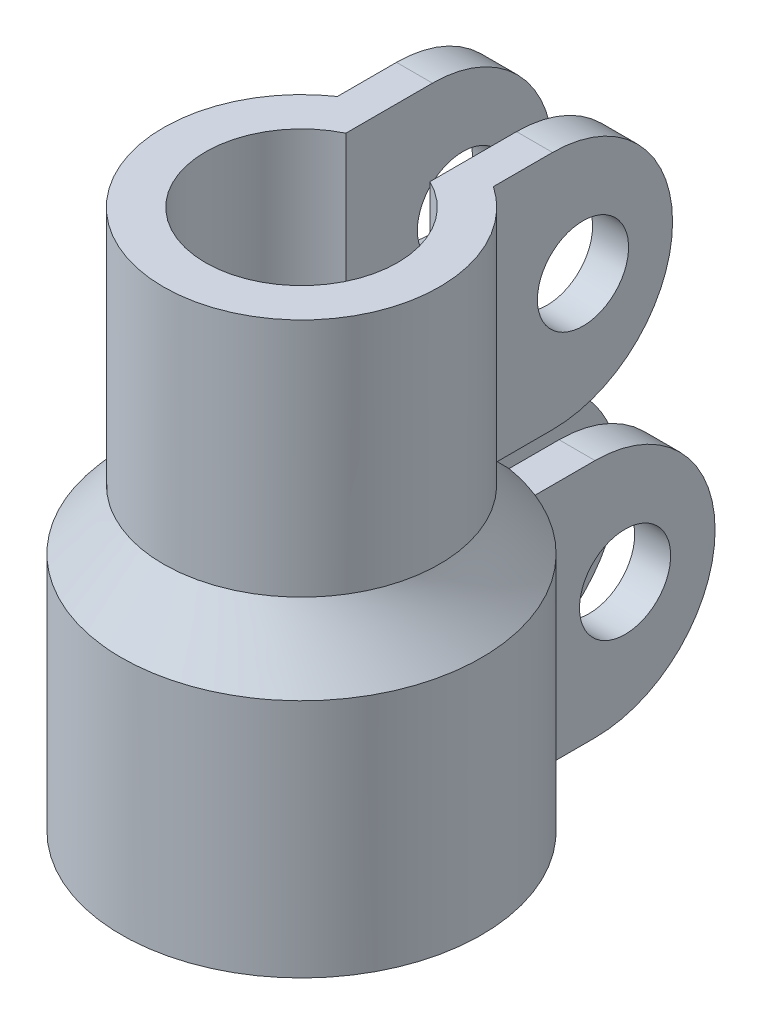
ISO-10303-21;
HEADER;
FILE_DESCRIPTION(('STEP AP214'),'2;1');
FILE_NAME('part.step','',(''),(''),'','','');
FILE_SCHEMA(('AUTOMOTIVE_DESIGN { 1 0 10303 214 1 1 1 1 }'));
ENDSEC;
DATA;
#1=APPLICATION_CONTEXT('core data for automotive mechanical design processes');
#2=APPLICATION_PROTOCOL_DEFINITION('international standard','automotive_design',2000,#1);
#3=PRODUCT_CONTEXT('',#1,'mechanical');
#4=PRODUCT('Part','Part','',(#3));
#5=PRODUCT_RELATED_PRODUCT_CATEGORY('part','',(#4));
#6=PRODUCT_DEFINITION_FORMATION('','',#4);
#7=PRODUCT_DEFINITION_CONTEXT('part definition',#1,'design');
#8=PRODUCT_DEFINITION('design','',#6,#7);
#9=PRODUCT_DEFINITION_SHAPE('','',#8);
#10=(LENGTH_UNIT() NAMED_UNIT(*) SI_UNIT(.MILLI.,.METRE.));
#11=(NAMED_UNIT(*) PLANE_ANGLE_UNIT() SI_UNIT($,.RADIAN.));
#12=(NAMED_UNIT(*) SI_UNIT($,.STERADIAN.) SOLID_ANGLE_UNIT());
#13=UNCERTAINTY_MEASURE_WITH_UNIT(LENGTH_MEASURE(1.E-05),#10,'distance_accuracy_value','');
#14=(GEOMETRIC_REPRESENTATION_CONTEXT(3) GLOBAL_UNCERTAINTY_ASSIGNED_CONTEXT((#13)) GLOBAL_UNIT_ASSIGNED_CONTEXT((#10,
#11,#12)) REPRESENTATION_CONTEXT('',''));
#15=CARTESIAN_POINT('',(0.,0.,0.));
#16=DIRECTION('',(0.,0.,1.));
#17=DIRECTION('',(1.,0.,0.));
#18=AXIS2_PLACEMENT_3D('',#15,#16,#17);
#19=CARTESIAN_POINT('',(0.,10.,0.));
#20=DIRECTION('',(0.,1.,0.));
#21=DIRECTION('',(0.,0.,1.));
#22=AXIS2_PLACEMENT_3D('',#19,#20,#21);
#23=PLANE('',#22);
#24=DIRECTION('',(0.,0.,-1.));
#25=VECTOR('',#24,1.);
#26=CARTESIAN_POINT('',(2.75,10.,-14.4776428684764));
#27=LINE('',#26,#25);
#28=CARTESIAN_POINT('',(2.75000131163433,10.,-6.97764619469728));
#29=VERTEX_POINT('',#28);
#30=CARTESIAN_POINT('',(2.75,10.,-9.47764286847643));
#31=VERTEX_POINT('',#30);
#32=EDGE_CURVE('E547',#29,#31,#27,.T.);
#33=ORIENTED_EDGE('',*,*,#32,.T.);
#34=DIRECTION('',(-1.,0.,0.));
#35=VECTOR('',#34,1.);
#36=CARTESIAN_POINT('',(1.24999999999999,10.,-9.47764286847643));
#37=LINE('',#36,#35);
#38=CARTESIAN_POINT('',(1.25,10.,-9.47764286847643));
#39=VERTEX_POINT('',#38);
#40=EDGE_CURVE('E58',#31,#39,#37,.T.);
#41=ORIENTED_EDGE('',*,*,#40,.T.);
#42=DIRECTION('',(0.,0.,1.));
#43=VECTOR('',#42,1.);
#44=CARTESIAN_POINT('',(1.25,10.,-14.4776428684764));
#45=LINE('',#44,#43);
#46=CARTESIAN_POINT('',(1.25,10.,-7.39509972887452));
#47=VERTEX_POINT('',#46);
#48=EDGE_CURVE('E542',#39,#47,#45,.T.);
#49=ORIENTED_EDGE('',*,*,#48,.T.);
#50=CARTESIAN_POINT('',(1.25,10.,-7.39509972887452));
#51=CARTESIAN_POINT('',(1.3142348254153,10.,-7.38424227098654));
#52=CARTESIAN_POINT('',(1.3783281025876,10.,-7.37254748813755));
#53=CARTESIAN_POINT('',(1.50605893350468,10.,-7.34751743854958));
#54=CARTESIAN_POINT('',(1.56969714673334,10.,-7.33418553715928));
#55=CARTESIAN_POINT('',(1.69651983990915,10.,-7.30589050781949));
#56=CARTESIAN_POINT('',(1.7597048158399,10.,-7.29092960292035));
#57=CARTESIAN_POINT('',(1.88562239175067,10.,-7.25938274945038));
#58=CARTESIAN_POINT('',(1.94835526863261,10.,-7.24279790611051));
#59=CARTESIAN_POINT('',(2.07336951501088,10.,-7.20800586957246));
#60=CARTESIAN_POINT('',(2.13565088450721,10.,-7.18979867637428));
#61=CARTESIAN_POINT('',(2.2597621359239,10.,-7.15176136365531));
#62=CARTESIAN_POINT('',(2.32159168397672,10.,-7.13193015475733));
#63=CARTESIAN_POINT('',(2.4447980403874,10.,-7.09064095605224));
#64=CARTESIAN_POINT('',(2.50617412499966,10.,-7.06918080658197));
#65=CARTESIAN_POINT('',(2.62847137646913,10.,-7.0246268973017));
#66=CARTESIAN_POINT('',(2.68939136946655,10.,-7.00152991529619));
#67=CARTESIAN_POINT('',(2.7500000006213,10.,-6.97764286823157));
#68=B_SPLINE_CURVE_WITH_KNOTS('',3,(#50,#51,#52,#53,#54,#55,#56,#57,#58,#59,#60,#61,#62,#63,#64,
#65,#66,#67),.UNSPECIFIED.,.F.,.F.,(4,2,2,2,2,2,2,2,4),(0.,0.195432346115492,0.390469472873585,
0.585243697598916,0.779886270969312,0.974528844339706,1.16930306906503,1.36434019582313,
1.55977254193858),.UNSPECIFIED.);
#69=EDGE_CURVE('E462',#47,#29,#68,.T.);
#70=ORIENTED_EDGE('',*,*,#69,.T.);
#71=EDGE_LOOP('',(#33,#41,#49,#70));
#72=FACE_BOUND('',#71,.T.);
#73=ADVANCED_FACE('F48',(#72),#23,.T.);
#74=DIRECTION('',(0.,0.,-1.));
#75=VECTOR('',#74,1.);
#76=CARTESIAN_POINT('',(-1.25,10.,-14.4776428684764));
#77=LINE('',#76,#75);
#78=CARTESIAN_POINT('',(-1.25,10.,-7.39509972887452));
#79=VERTEX_POINT('',#78);
#80=CARTESIAN_POINT('',(-1.25,10.,-9.47764286847643));
#81=VERTEX_POINT('',#80);
#82=EDGE_CURVE('E556',#79,#81,#77,.T.);
#83=ORIENTED_EDGE('',*,*,#82,.T.);
#84=DIRECTION('',(-1.,0.,0.));
#85=VECTOR('',#84,1.);
#86=CARTESIAN_POINT('',(-2.75,10.,-9.47764286847643));
#87=LINE('',#86,#85);
#88=CARTESIAN_POINT('',(-2.75,10.,-9.47764286847643));
#89=VERTEX_POINT('',#88);
#90=EDGE_CURVE('E12',#81,#89,#87,.T.);
#91=ORIENTED_EDGE('',*,*,#90,.T.);
#92=DIRECTION('',(0.,0.,1.));
#93=VECTOR('',#92,1.);
#94=CARTESIAN_POINT('',(-2.75,10.,-14.4776428684764));
#95=LINE('',#94,#93);
#96=CARTESIAN_POINT('',(-2.75000046835111,10.,-6.97764129596585));
#97=VERTEX_POINT('',#96);
#98=EDGE_CURVE('E567',#89,#97,#95,.T.);
#99=ORIENTED_EDGE('',*,*,#98,.T.);
#100=CARTESIAN_POINT('',(0.,10.,0.));
#101=DIRECTION('',(0.,1.,0.));
#102=DIRECTION('',(0.,0.,1.));
#103=AXIS2_PLACEMENT_3D('',#100,#101,#102);
#104=CIRCLE('',#103,7.5);
#105=EDGE_CURVE('E226',#79,#97,#104,.T.);
#106=ORIENTED_EDGE('',*,*,#105,.F.);
#107=EDGE_LOOP('',(#83,#91,#99,#106));
#108=FACE_BOUND('',#107,.T.);
#109=ADVANCED_FACE('F432',(#108),#23,.T.);
#110=CARTESIAN_POINT('',(0.,10.,0.));
#111=DIRECTION('',(0.,-1.,0.));
#112=DIRECTION('',(0.,0.,-1.));
#113=AXIS2_PLACEMENT_3D('',#110,#111,#112);
#114=CYLINDRICAL_SURFACE('',#113,7.5);
#115=CARTESIAN_POINT('',(0.,0.,0.));
#116=DIRECTION('',(0.,1.,0.));
#117=DIRECTION('',(0.,0.,1.));
#118=AXIS2_PLACEMENT_3D('',#115,#116,#117);
#119=CIRCLE('',#118,7.5);
#120=CARTESIAN_POINT('',(-2.75,0.,-6.97764286847643));
#121=VERTEX_POINT('',#120);
#122=CARTESIAN_POINT('',(2.75,0.,-6.97764286847643));
#123=VERTEX_POINT('',#122);
#124=EDGE_CURVE('E515',#121,#123,#119,.T.);
#125=ORIENTED_EDGE('',*,*,#124,.T.);
#126=DIRECTION('',(0.,-1.,0.));
#127=VECTOR('',#126,1.);
#128=CARTESIAN_POINT('',(2.75,10.,-6.97764286847643));
#129=LINE('',#128,#127);
#130=EDGE_CURVE('E609',#29,#123,#129,.T.);
#131=ORIENTED_EDGE('',*,*,#130,.F.);
#132=CARTESIAN_POINT('',(-1.25,10.,-7.39509972887452));
#133=CARTESIAN_POINT('',(-13.8765670294396,10.,-5.26082035936538));
#134=CARTESIAN_POINT('',(-12.8056762170548,10.,7.5));
#135=CARTESIAN_POINT('',(12.8056762170549,10.,7.5));
#136=CARTESIAN_POINT('',(13.8765670294396,10.,-5.26082035936538));
#137=CARTESIAN_POINT('',(1.25,10.,-7.39509972887452));
#138=(BOUNDED_CURVE() B_SPLINE_CURVE(3,(#132,#133,#134,#135,#136,#137),.UNSPECIFIED.,.F.,
.F.) B_SPLINE_CURVE_WITH_KNOTS((4,2,4),(0.,0.5,1.),
.UNSPECIFIED.) CURVE() GEOMETRIC_REPRESENTATION_ITEM() RATIONAL_B_SPLINE_CURVE((1.,
0.151386494083577,0.058902088932567,0.058902088932567,0.151386494083577,1.)) REPRESENTATION_ITEM(''));
#139=EDGE_CURVE('E606',#97,#29,#138,.T.);
#140=ORIENTED_EDGE('',*,*,#139,.F.);
#141=DIRECTION('',(0.,-1.,0.));
#142=VECTOR('',#141,1.);
#143=CARTESIAN_POINT('',(-2.75,10.,-6.97764286847643));
#144=LINE('',#143,#142);
#145=EDGE_CURVE('E594',#97,#121,#144,.T.);
#146=ORIENTED_EDGE('',*,*,#145,.T.);
#147=EDGE_LOOP('',(#125,#131,#140,#146));
#148=FACE_BOUND('',#147,.T.);
#149=ADVANCED_FACE('F438',(#148),#114,.T.);
#150=CARTESIAN_POINT('',(2.75,10.,-14.4776428684764));
#151=DIRECTION('',(-1.,0.,0.));
#152=DIRECTION('',(0.,0.,1.));
#153=AXIS2_PLACEMENT_3D('',#150,#151,#152);
#154=PLANE('',#153);
#155=CARTESIAN_POINT('',(2.75,5.,-10.7276420822211));
#156=DIRECTION('',(-1.,0.,0.));
#157=DIRECTION('',(0.,0.,1.));
#158=AXIS2_PLACEMENT_3D('',#155,#156,#157);
#159=CIRCLE('',#158,1.89865);
#160=CARTESIAN_POINT('',(2.75,5.,-8.82899208222114));
#161=VERTEX_POINT('',#160);
#162=EDGE_CURVE('E939',#161,#161,#159,.T.);
#163=ORIENTED_EDGE('',*,*,#162,.T.);
#164=EDGE_LOOP('',(#163));
#165=FACE_BOUND('',#164,.T.);
#166=DIRECTION('',(0.,0.,-1.));
#167=VECTOR('',#166,1.);
#168=CARTESIAN_POINT('',(2.75,0.,-14.4776428684764));
#169=LINE('',#168,#167);
#170=CARTESIAN_POINT('',(2.75,0.,-9.47764286847643));
#171=VERTEX_POINT('',#170);
#172=EDGE_CURVE('E941',#123,#171,#169,.T.);
#173=ORIENTED_EDGE('',*,*,#172,.T.);
#174=CARTESIAN_POINT('',(2.75,5.,-9.47764286847643));
#175=DIRECTION('',(-1.,0.,0.));
#176=DIRECTION('',(0.,0.,1.));
#177=AXIS2_PLACEMENT_3D('',#174,#175,#176);
#178=CIRCLE('',#177,5.);
#179=CARTESIAN_POINT('',(2.75,5.,-14.4776428684764));
#180=VERTEX_POINT('',#179);
#181=EDGE_CURVE('E591',#171,#180,#178,.F.);
#182=ORIENTED_EDGE('',*,*,#181,.T.);
#183=CARTESIAN_POINT('',(2.75,5.,-9.47764286847643));
#184=DIRECTION('',(-1.,0.,0.));
#185=DIRECTION('',(0.,0.,1.));
#186=AXIS2_PLACEMENT_3D('',#183,#184,#185);
#187=CIRCLE('',#186,5.);
#188=EDGE_CURVE('E966',#180,#31,#187,.F.);
#189=ORIENTED_EDGE('',*,*,#188,.T.);
#190=ORIENTED_EDGE('',*,*,#32,.F.);
#191=ORIENTED_EDGE('',*,*,#130,.T.);
#192=EDGE_LOOP('',(#173,#182,#189,#190,#191));
#193=FACE_BOUND('',#192,.T.);
#194=ADVANCED_FACE('F692',(#165,#193),#154,.F.);
#195=CARTESIAN_POINT('',(1.25,10.,-14.4776428684764));
#196=DIRECTION('',(1.,0.,0.));
#197=DIRECTION('',(0.,0.,-1.));
#198=AXIS2_PLACEMENT_3D('',#195,#196,#197);
#199=PLANE('',#198);
#200=CARTESIAN_POINT('',(1.25,5.,-10.7276420822211));
#201=DIRECTION('',(1.,0.,0.));
#202=DIRECTION('',(0.,0.,-1.));
#203=AXIS2_PLACEMENT_3D('',#200,#201,#202);
#204=CIRCLE('',#203,1.89865);
#205=CARTESIAN_POINT('',(1.25,5.,-12.6262920822211));
#206=VERTEX_POINT('',#205);
#207=EDGE_CURVE('E990',#206,#206,#204,.T.);
#208=ORIENTED_EDGE('',*,*,#207,.T.);
#209=EDGE_LOOP('',(#208));
#210=FACE_BOUND('',#209,.T.);
#211=CARTESIAN_POINT('',(1.25,5.,-9.47764286847643));
#212=DIRECTION('',(1.,0.,0.));
#213=DIRECTION('',(0.,0.,-1.));
#214=AXIS2_PLACEMENT_3D('',#211,#212,#213);
#215=CIRCLE('',#214,5.);
#216=CARTESIAN_POINT('',(1.25,5.,-14.4776428684764));
#217=VERTEX_POINT('',#216);
#218=EDGE_CURVE('E548',#39,#217,#215,.F.);
#219=ORIENTED_EDGE('',*,*,#218,.T.);
#220=CARTESIAN_POINT('',(1.25,5.,-9.47764286847643));
#221=DIRECTION('',(1.,0.,0.));
#222=DIRECTION('',(0.,0.,-1.));
#223=AXIS2_PLACEMENT_3D('',#220,#221,#222);
#224=CIRCLE('',#223,5.);
#225=CARTESIAN_POINT('',(1.25,0.,-9.47764286847643));
#226=VERTEX_POINT('',#225);
#227=EDGE_CURVE('E974',#217,#226,#224,.F.);
#228=ORIENTED_EDGE('',*,*,#227,.T.);
#229=DIRECTION('',(0.,0.,1.));
#230=VECTOR('',#229,1.);
#231=CARTESIAN_POINT('',(1.25,0.,-14.4776428684764));
#232=LINE('',#231,#230);
#233=CARTESIAN_POINT('',(1.25,0.,-5.86834729715275));
#234=VERTEX_POINT('',#233);
#235=EDGE_CURVE('E949',#226,#234,#232,.T.);
#236=ORIENTED_EDGE('',*,*,#235,.T.);
#237=DIRECTION('',(0.,-1.,0.));
#238=VECTOR('',#237,1.);
#239=CARTESIAN_POINT('',(1.25,10.,-5.86834729715275));
#240=LINE('',#239,#238);
#241=CARTESIAN_POINT('',(1.25000000000001,10.,-5.86834729715275));
#242=VERTEX_POINT('',#241);
#243=EDGE_CURVE('E613',#242,#234,#240,.T.);
#244=ORIENTED_EDGE('',*,*,#243,.F.);
#245=DIRECTION('',(0.,0.,1.));
#246=VECTOR('',#245,1.);
#247=CARTESIAN_POINT('',(1.25,10.,-7.39509972887452));
#248=LINE('',#247,#246);
#249=EDGE_CURVE('E571',#47,#242,#248,.T.);
#250=ORIENTED_EDGE('',*,*,#249,.F.);
#251=ORIENTED_EDGE('',*,*,#48,.F.);
#252=EDGE_LOOP('',(#219,#228,#236,#244,#250,#251));
#253=FACE_BOUND('',#252,.T.);
#254=ADVANCED_FACE('F855',(#210,#253),#199,.F.);
#255=CARTESIAN_POINT('',(0.,10.,0.));
#256=DIRECTION('',(0.,-1.,0.));
#257=DIRECTION('',(0.,0.,-1.));
#258=AXIS2_PLACEMENT_3D('',#255,#256,#257);
#259=CYLINDRICAL_SURFACE('',#258,6.);
#260=CARTESIAN_POINT('',(0.,0.,0.));
#261=DIRECTION('',(0.,-1.,0.));
#262=DIRECTION('',(0.,0.,1.));
#263=AXIS2_PLACEMENT_3D('',#260,#261,#262);
#264=CIRCLE('',#263,6.);
#265=CARTESIAN_POINT('',(-1.25,0.,-5.86834729715275));
#266=VERTEX_POINT('',#265);
#267=EDGE_CURVE('E673',#234,#266,#264,.T.);
#268=ORIENTED_EDGE('',*,*,#267,.T.);
#269=DIRECTION('',(0.,-1.,0.));
#270=VECTOR('',#269,1.);
#271=CARTESIAN_POINT('',(-1.25,10.,-5.86834729715275));
#272=LINE('',#271,#270);
#273=CARTESIAN_POINT('',(-1.25,10.,-5.86834729715275));
#274=VERTEX_POINT('',#273);
#275=EDGE_CURVE('E601',#274,#266,#272,.T.);
#276=ORIENTED_EDGE('',*,*,#275,.F.);
#277=CARTESIAN_POINT('',(0.,10.,0.));
#278=DIRECTION('',(0.,-1.,0.));
#279=DIRECTION('',(0.,0.,-1.));
#280=AXIS2_PLACEMENT_3D('',#277,#278,#279);
#281=CIRCLE('',#280,6.);
#282=EDGE_CURVE('E546',#242,#274,#281,.T.);
#283=ORIENTED_EDGE('',*,*,#282,.F.);
#284=ORIENTED_EDGE('',*,*,#243,.T.);
#285=EDGE_LOOP('',(#268,#276,#283,#284));
#286=FACE_BOUND('',#285,.T.);
#287=ADVANCED_FACE('F671',(#286),#259,.F.);
#288=CARTESIAN_POINT('',(-1.25,10.,-14.4776428684764));
#289=DIRECTION('',(-1.,0.,0.));
#290=DIRECTION('',(0.,0.,1.));
#291=AXIS2_PLACEMENT_3D('',#288,#289,#290);
#292=PLANE('',#291);
#293=CARTESIAN_POINT('',(-1.25,5.,-10.7276420822211));
#294=DIRECTION('',(-1.,0.,0.));
#295=DIRECTION('',(0.,0.,1.));
#296=AXIS2_PLACEMENT_3D('',#293,#294,#295);
#297=CIRCLE('',#296,1.89865);
#298=CARTESIAN_POINT('',(-1.25,5.,-8.82899208222114));
#299=VERTEX_POINT('',#298);
#300=EDGE_CURVE('E249',#299,#299,#297,.T.);
#301=ORIENTED_EDGE('',*,*,#300,.T.);
#302=EDGE_LOOP('',(#301));
#303=FACE_BOUND('',#302,.T.);
#304=DIRECTION('',(0.,0.,-1.));
#305=VECTOR('',#304,1.);
#306=CARTESIAN_POINT('',(-1.25,0.,-14.4776428684764));
#307=LINE('',#306,#305);
#308=CARTESIAN_POINT('',(-1.25,0.,-9.47764286847643));
#309=VERTEX_POINT('',#308);
#310=EDGE_CURVE('E955',#266,#309,#307,.T.);
#311=ORIENTED_EDGE('',*,*,#310,.T.);
#312=CARTESIAN_POINT('',(-1.25,5.,-9.47764286847643));
#313=DIRECTION('',(-1.,0.,0.));
#314=DIRECTION('',(0.,0.,1.));
#315=AXIS2_PLACEMENT_3D('',#312,#313,#314);
#316=CIRCLE('',#315,5.);
#317=CARTESIAN_POINT('',(-1.25,5.,-14.4776428684764));
#318=VERTEX_POINT('',#317);
#319=EDGE_CURVE('E339',#309,#318,#316,.F.);
#320=ORIENTED_EDGE('',*,*,#319,.T.);
#321=CARTESIAN_POINT('',(-1.25,5.,-9.47764286847643));
#322=DIRECTION('',(-1.,0.,0.));
#323=DIRECTION('',(0.,0.,1.));
#324=AXIS2_PLACEMENT_3D('',#321,#322,#323);
#325=CIRCLE('',#324,5.);
#326=EDGE_CURVE('E579',#318,#81,#325,.F.);
#327=ORIENTED_EDGE('',*,*,#326,.T.);
#328=ORIENTED_EDGE('',*,*,#82,.F.);
#329=DIRECTION('',(0.,0.,1.));
#330=VECTOR('',#329,1.);
#331=CARTESIAN_POINT('',(-1.25,10.,0.));
#332=LINE('',#331,#330);
#333=EDGE_CURVE('E464',#274,#79,#332,.F.);
#334=ORIENTED_EDGE('',*,*,#333,.F.);
#335=ORIENTED_EDGE('',*,*,#275,.T.);
#336=EDGE_LOOP('',(#311,#320,#327,#328,#334,#335));
#337=FACE_BOUND('',#336,.T.);
#338=ADVANCED_FACE('F576',(#303,#337),#292,.F.);
#339=CARTESIAN_POINT('',(-2.75,10.,-14.4776428684764));
#340=DIRECTION('',(1.,0.,0.));
#341=DIRECTION('',(0.,0.,-1.));
#342=AXIS2_PLACEMENT_3D('',#339,#340,#341);
#343=PLANE('',#342);
#344=CARTESIAN_POINT('',(-2.75,5.,-10.7276420822211));
#345=DIRECTION('',(-1.,0.,0.));
#346=DIRECTION('',(0.,0.,1.));
#347=AXIS2_PLACEMENT_3D('',#344,#345,#346);
#348=CIRCLE('',#347,1.89865);
#349=CARTESIAN_POINT('',(-2.75,5.,-8.82899208222114));
#350=VERTEX_POINT('',#349);
#351=EDGE_CURVE('E997',#350,#350,#348,.T.);
#352=ORIENTED_EDGE('',*,*,#351,.F.);
#353=EDGE_LOOP('',(#352));
#354=FACE_BOUND('',#353,.T.);
#355=CARTESIAN_POINT('',(-2.75,5.,-9.47764286847643));
#356=DIRECTION('',(1.,0.,0.));
#357=DIRECTION('',(0.,0.,-1.));
#358=AXIS2_PLACEMENT_3D('',#355,#356,#357);
#359=CIRCLE('',#358,5.);
#360=CARTESIAN_POINT('',(-2.75,5.,-14.4776428684764));
#361=VERTEX_POINT('',#360);
#362=EDGE_CURVE('E586',#89,#361,#359,.F.);
#363=ORIENTED_EDGE('',*,*,#362,.T.);
#364=CARTESIAN_POINT('',(-2.75,5.,-9.47764286847643));
#365=DIRECTION('',(1.,0.,0.));
#366=DIRECTION('',(0.,0.,-1.));
#367=AXIS2_PLACEMENT_3D('',#364,#365,#366);
#368=CIRCLE('',#367,5.);
#369=CARTESIAN_POINT('',(-2.75,0.,-9.47764286847643));
#370=VERTEX_POINT('',#369);
#371=EDGE_CURVE('E583',#361,#370,#368,.F.);
#372=ORIENTED_EDGE('',*,*,#371,.T.);
#373=DIRECTION('',(0.,0.,1.));
#374=VECTOR('',#373,1.);
#375=CARTESIAN_POINT('',(-2.75,0.,-14.4776428684764));
#376=LINE('',#375,#374);
#377=EDGE_CURVE('E560',#370,#121,#376,.T.);
#378=ORIENTED_EDGE('',*,*,#377,.T.);
#379=ORIENTED_EDGE('',*,*,#145,.F.);
#380=ORIENTED_EDGE('',*,*,#98,.F.);
#381=EDGE_LOOP('',(#363,#372,#378,#379,#380));
#382=FACE_BOUND('',#381,.T.);
#383=ADVANCED_FACE('F829',(#354,#382),#343,.F.);
#384=CARTESIAN_POINT('',(0.,0.,0.));
#385=DIRECTION('',(0.,1.,0.));
#386=DIRECTION('',(0.,0.,1.));
#387=AXIS2_PLACEMENT_3D('',#384,#385,#386);
#388=PLANE('',#387);
#389=ORIENTED_EDGE('',*,*,#235,.F.);
#390=DIRECTION('',(-1.,0.,0.));
#391=VECTOR('',#390,1.);
#392=CARTESIAN_POINT('',(0.,0.,-9.47764286847643));
#393=LINE('',#392,#391);
#394=EDGE_CURVE('E973',#226,#171,#393,.F.);
#395=ORIENTED_EDGE('',*,*,#394,.T.);
#396=ORIENTED_EDGE('',*,*,#172,.F.);
#397=ORIENTED_EDGE('',*,*,#124,.F.);
#398=ORIENTED_EDGE('',*,*,#377,.F.);
#399=DIRECTION('',(-1.,0.,0.));
#400=VECTOR('',#399,1.);
#401=CARTESIAN_POINT('',(0.,0.,-9.47764286847643));
#402=LINE('',#401,#400);
#403=EDGE_CURVE('E970',#370,#309,#402,.F.);
#404=ORIENTED_EDGE('',*,*,#403,.T.);
#405=ORIENTED_EDGE('',*,*,#310,.F.);
#406=ORIENTED_EDGE('',*,*,#267,.F.);
#407=EDGE_LOOP('',(#389,#395,#396,#397,#398,#404,#405,#406));
#408=FACE_BOUND('',#407,.T.);
#409=ADVANCED_FACE('F446',(#408),#388,.F.);
#410=CARTESIAN_POINT('',(3.85906040268456,2.70134228187919,0.));
#411=DIRECTION('',(-0.819231920519041,-0.573462344363328,0.));
#412=DIRECTION('',(0.573462344363328,-0.819231920519041,0.));
#413=AXIS2_PLACEMENT_3D('',#410,#411,#412);
#414=PLANE('',#413);
#415=DIRECTION('',(-0.444338036937529,0.634768624196471,0.63216493311969));
#416=VECTOR('',#415,1.);
#417=CARTESIAN_POINT('',(-1.25,10.,-7.39509972887452));
#418=LINE('',#417,#416);
#419=CARTESIAN_POINT('',(-3.,12.5,-4.90535421758715));
#420=VERTEX_POINT('',#419);
#421=EDGE_CURVE('E655',#79,#420,#418,.T.);
#422=ORIENTED_EDGE('',*,*,#421,.T.);
#423=DIRECTION('',(0.,0.,-1.));
#424=VECTOR('',#423,1.);
#425=CARTESIAN_POINT('',(-3.,12.5,-4.90535421758715));
#426=LINE('',#425,#424);
#427=CARTESIAN_POINT('',(-3.,12.5,-3.01039864469807));
#428=VERTEX_POINT('',#427);
#429=EDGE_CURVE('E271',#428,#420,#426,.T.);
#430=ORIENTED_EDGE('',*,*,#429,.F.);
#431=DIRECTION('',(-0.418564828226014,0.597949754608591,0.683563878167691));
#432=VECTOR('',#431,1.);
#433=CARTESIAN_POINT('',(-1.25,10.,-5.86834729715275));
#434=LINE('',#433,#432);
#435=EDGE_CURVE('E641',#274,#428,#434,.T.);
#436=ORIENTED_EDGE('',*,*,#435,.F.);
#437=ORIENTED_EDGE('',*,*,#333,.T.);
#438=EDGE_LOOP('',(#422,#430,#436,#437));
#439=FACE_BOUND('',#438,.T.);
#440=ADVANCED_FACE('F669',(#439),#414,.F.);
#441=CARTESIAN_POINT('',(1.25000000000001,10.,-5.86834729715275));
#442=CARTESIAN_POINT('',(3.,12.5,-3.01039864469807));
#443=CARTESIAN_POINT('',(10.9004949255246,10.,-3.8127227667575));
#444=CARTESIAN_POINT('',(6.15488313024357,12.5,0.133586756504486));
#445=CARTESIAN_POINT('',(9.86699774589713,10.,6.00000000000001));
#446=CARTESIAN_POINT('',(4.45397931837029,12.5,4.25));
#447=CARTESIAN_POINT('',(-9.86699774589714,10.,5.99999999999999));
#448=CARTESIAN_POINT('',(-4.45397931837029,12.5,4.25));
#449=CARTESIAN_POINT('',(-10.9004949255246,10.,-3.81272276675752));
#450=CARTESIAN_POINT('',(-6.15488313024357,12.5,0.133586756504488));
#451=CARTESIAN_POINT('',(-1.25,10.,-5.86834729715275));
#452=CARTESIAN_POINT('',(-3.,12.5,-3.01039864469807));
#453=(BOUNDED_SURFACE() B_SPLINE_SURFACE(3,1,((#441,#442),(#443,#444),(#445,#446),(#447,#448),
(#449,#450),(#451,#452)),.UNSPECIFIED.,.F.,.F.,.F.) B_SPLINE_SURFACE_WITH_KNOTS((4,2,4),(2,2),
(0.,0.5,1.),(0.,1.),
.UNSPECIFIED.) GEOMETRIC_REPRESENTATION_ITEM() RATIONAL_B_SPLINE_SURFACE(((1.,1.),
(0.162539502072891,0.345653127778946),(0.0655297313484511,0.20321732796769),(0.0655297313484511,
0.20321732796769),(0.162539502072891,0.345653127778946),(1.,1.))) REPRESENTATION_ITEM('') SURFACE());
#454=CARTESIAN_POINT('',(0.,12.5,0.));
#455=DIRECTION('',(0.,-1.,0.));
#456=DIRECTION('',(0.,0.,1.));
#457=AXIS2_PLACEMENT_3D('',#454,#455,#456);
#458=CIRCLE('',#457,4.25);
#459=CARTESIAN_POINT('',(3.,12.5,-3.01039864469807));
#460=VERTEX_POINT('',#459);
#461=EDGE_CURVE('E516',#460,#428,#458,.T.);
#462=DIRECTION('',(0.418564828226012,0.597949754608591,0.683563878167691));
#463=VECTOR('',#462,1.);
#464=CARTESIAN_POINT('',(1.25000000000001,10.,-5.86834729715275));
#465=LINE('',#464,#463);
#466=EDGE_CURVE('E638',#242,#460,#465,.T.);
#467=ORIENTED_EDGE('',*,*,#282,.T.);
#468=ORIENTED_EDGE('',*,*,#435,.T.);
#469=ORIENTED_EDGE('',*,*,#461,.F.);
#470=ORIENTED_EDGE('',*,*,#466,.F.);
#471=EDGE_LOOP('',(#467,#468,#469,#470));
#472=FACE_BOUND('',#471,.T.);
#473=ADVANCED_FACE('F472',(#472),#453,.T.);
#474=CARTESIAN_POINT('',(-1.25,10.,-7.39509972887452));
#475=CARTESIAN_POINT('',(-3.,12.5,-4.90535421758715));
#476=CARTESIAN_POINT('',(-13.8765670294396,10.,-5.26082035936538));
#477=CARTESIAN_POINT('',(-9.12412868937518,12.5,-1.15998023373597));
#478=CARTESIAN_POINT('',(-12.8056762170548,10.,7.5));
#479=CARTESIAN_POINT('',(-7.17863346904809,12.5,5.75));
#480=CARTESIAN_POINT('',(12.8056762170549,10.,7.5));
#481=CARTESIAN_POINT('',(7.17863346904809,12.5,5.75));
#482=CARTESIAN_POINT('',(13.8765670294396,10.,-5.26082035936538));
#483=CARTESIAN_POINT('',(9.12412868937518,12.5,-1.15998023373597));
#484=CARTESIAN_POINT('',(1.25,10.,-7.39509972887452));
#485=CARTESIAN_POINT('',(3.,12.5,-4.90535421758715));
#486=(BOUNDED_SURFACE() B_SPLINE_SURFACE(3,1,((#474,#475),(#476,#477),(#478,#479),(#480,#481),
(#482,#483),(#484,#485)),.UNSPECIFIED.,.F.,.F.,.F.) B_SPLINE_SURFACE_WITH_KNOTS((4,2,4),(2,2),
(0.,0.5,1.),(0.,1.),
.UNSPECIFIED.) GEOMETRIC_REPRESENTATION_ITEM() RATIONAL_B_SPLINE_SURFACE(((1.,1.),
(0.151386494083577,0.264204167413399),(0.058902088932567,0.135803041124397),(0.058902088932567,
0.135803041124397),(0.151386494083577,0.264204167413399),(1.,1.))) REPRESENTATION_ITEM('') SURFACE());
#487=DIRECTION('',(0.44433803693753,0.634768624196471,0.63216493311969));
#488=VECTOR('',#487,1.);
#489=CARTESIAN_POINT('',(2.125,11.25,-6.15022697323083));
#490=LINE('',#489,#488);
#491=CARTESIAN_POINT('',(3.,12.5,-4.90535421758715));
#492=VERTEX_POINT('',#491);
#493=EDGE_CURVE('E648',#47,#492,#490,.T.);
#494=CARTESIAN_POINT('',(0.,12.5,0.));
#495=DIRECTION('',(0.,1.,0.));
#496=DIRECTION('',(0.,0.,1.));
#497=AXIS2_PLACEMENT_3D('',#494,#495,#496);
#498=CIRCLE('',#497,5.75);
#499=CARTESIAN_POINT('',(3.25000039663741,12.5,-4.74341536788376));
#500=VERTEX_POINT('',#499);
#501=EDGE_CURVE('E511',#500,#492,#498,.T.);
#502=CARTESIAN_POINT('',(2.99999999999938,12.4999999999991,-4.90535421758802));
#503=CARTESIAN_POINT('',(9.12412868937613,12.4999999999995,-1.1599802337368));
#504=CARTESIAN_POINT('',(7.17863346904894,12.4999999999996,5.75000000000027));
#505=CARTESIAN_POINT('',(-7.17863346904894,12.4999999999996,5.75000000000027));
#506=CARTESIAN_POINT('',(-9.12412868937613,12.4999999999995,-1.1599802337368));
#507=CARTESIAN_POINT('',(-2.99999999999939,12.4999999999991,-4.90535421758802));
#508=(BOUNDED_CURVE() B_SPLINE_CURVE(3,(#502,#503,#504,#505,#506,#507),.UNSPECIFIED.,.F.,
.F.) B_SPLINE_CURVE_WITH_KNOTS((4,2,4),(0.,0.5,1.),
.UNSPECIFIED.) CURVE() GEOMETRIC_REPRESENTATION_ITEM() RATIONAL_B_SPLINE_CURVE((1.,
0.264204167413359,0.13580304112437,0.13580304112437,0.264204167413359,1.)) REPRESENTATION_ITEM(''));
#509=CARTESIAN_POINT('',(-3.25000139553293,12.5,-4.74341254106969));
#510=VERTEX_POINT('',#509);
#511=EDGE_CURVE('E320',#510,#500,#508,.F.);
#512=EDGE_CURVE('E324',#420,#510,#498,.T.);
#513=ORIENTED_EDGE('',*,*,#105,.T.);
#514=ORIENTED_EDGE('',*,*,#139,.T.);
#515=ORIENTED_EDGE('',*,*,#69,.F.);
#516=ORIENTED_EDGE('',*,*,#493,.T.);
#517=ORIENTED_EDGE('',*,*,#501,.F.);
#518=ORIENTED_EDGE('',*,*,#511,.F.);
#519=ORIENTED_EDGE('',*,*,#512,.F.);
#520=ORIENTED_EDGE('',*,*,#421,.F.);
#521=EDGE_LOOP('',(#513,#514,#515,#516,#517,#518,#519,#520));
#522=FACE_BOUND('',#521,.T.);
#523=ADVANCED_FACE('F466',(#522),#486,.T.);
#524=CARTESIAN_POINT('',(-3.85906040268455,2.70134228187917,0.));
#525=DIRECTION('',(0.819231920519042,-0.573462344363327,0.));
#526=DIRECTION('',(0.573462344363327,0.819231920519042,0.));
#527=AXIS2_PLACEMENT_3D('',#524,#525,#526);
#528=PLANE('',#527);
#529=ORIENTED_EDGE('',*,*,#466,.T.);
#530=DIRECTION('',(0.,0.,1.));
#531=VECTOR('',#530,1.);
#532=CARTESIAN_POINT('',(3.,12.5,-4.90535421758715));
#533=LINE('',#532,#531);
#534=EDGE_CURVE('E534',#492,#460,#533,.T.);
#535=ORIENTED_EDGE('',*,*,#534,.F.);
#536=ORIENTED_EDGE('',*,*,#493,.F.);
#537=ORIENTED_EDGE('',*,*,#249,.T.);
#538=EDGE_LOOP('',(#529,#535,#536,#537));
#539=FACE_BOUND('',#538,.T.);
#540=ADVANCED_FACE('F288',(#539),#528,.F.);
#541=CARTESIAN_POINT('',(0.,12.5,0.));
#542=DIRECTION('',(0.,1.,0.));
#543=DIRECTION('',(0.,0.,1.));
#544=AXIS2_PLACEMENT_3D('',#541,#542,#543);
#545=PLANE('',#544);
#546=DIRECTION('',(0.,0.,1.));
#547=VECTOR('',#546,1.);
#548=CARTESIAN_POINT('',(-3.25,12.5,-12.2061692138082));
#549=LINE('',#548,#547);
#550=CARTESIAN_POINT('',(-3.25,12.5,-7.20616921380822));
#551=VERTEX_POINT('',#550);
#552=EDGE_CURVE('E221',#551,#510,#549,.T.);
#553=ORIENTED_EDGE('',*,*,#552,.F.);
#554=DIRECTION('',(-1.,0.,0.));
#555=VECTOR('',#554,1.);
#556=CARTESIAN_POINT('',(0.,12.5,-7.20616921380822));
#557=LINE('',#556,#555);
#558=CARTESIAN_POINT('',(-1.75,12.5,-7.20616921380822));
#559=VERTEX_POINT('',#558);
#560=EDGE_CURVE('E351',#551,#559,#557,.F.);
#561=ORIENTED_EDGE('',*,*,#560,.T.);
#562=DIRECTION('',(0.,0.,-1.));
#563=VECTOR('',#562,1.);
#564=CARTESIAN_POINT('',(-1.75,12.5,-5.12362607420631));
#565=LINE('',#564,#563);
#566=CARTESIAN_POINT('',(-1.75,12.5,-3.59687364248454));
#567=VERTEX_POINT('',#566);
#568=EDGE_CURVE('E245',#567,#559,#565,.T.);
#569=ORIENTED_EDGE('',*,*,#568,.F.);
#570=CARTESIAN_POINT('',(0.,12.5,0.));
#571=DIRECTION('',(0.,-1.,0.));
#572=DIRECTION('',(0.,0.,1.));
#573=AXIS2_PLACEMENT_3D('',#570,#571,#572);
#574=CIRCLE('',#573,4.);
#575=CARTESIAN_POINT('',(1.75,12.5,-3.59687364248454));
#576=VERTEX_POINT('',#575);
#577=EDGE_CURVE('E253',#576,#567,#574,.T.);
#578=ORIENTED_EDGE('',*,*,#577,.F.);
#579=DIRECTION('',(0.,0.,1.));
#580=VECTOR('',#579,1.);
#581=CARTESIAN_POINT('',(1.75,12.5,-5.12362607420631));
#582=LINE('',#581,#580);
#583=CARTESIAN_POINT('',(1.75,12.5,-7.20616921380822));
#584=VERTEX_POINT('',#583);
#585=EDGE_CURVE('E250',#584,#576,#582,.T.);
#586=ORIENTED_EDGE('',*,*,#585,.F.);
#587=DIRECTION('',(-1.,0.,0.));
#588=VECTOR('',#587,1.);
#589=CARTESIAN_POINT('',(0.,12.5,-7.20616921380822));
#590=LINE('',#589,#588);
#591=CARTESIAN_POINT('',(3.25,12.5,-7.20616921380822));
#592=VERTEX_POINT('',#591);
#593=EDGE_CURVE('E347',#584,#592,#590,.F.);
#594=ORIENTED_EDGE('',*,*,#593,.T.);
#595=DIRECTION('',(0.,0.,-1.));
#596=VECTOR('',#595,1.);
#597=CARTESIAN_POINT('',(3.25,12.5,-12.2061692138082));
#598=LINE('',#597,#596);
#599=EDGE_CURVE('E254',#500,#592,#598,.T.);
#600=ORIENTED_EDGE('',*,*,#599,.F.);
#601=ORIENTED_EDGE('',*,*,#501,.T.);
#602=ORIENTED_EDGE('',*,*,#534,.T.);
#603=ORIENTED_EDGE('',*,*,#461,.T.);
#604=ORIENTED_EDGE('',*,*,#429,.T.);
#605=ORIENTED_EDGE('',*,*,#512,.T.);
#606=EDGE_LOOP('',(#553,#561,#569,#578,#586,#594,#600,#601,#602,#603,#604,#605));
#607=FACE_BOUND('',#606,.T.);
#608=ADVANCED_FACE('F277',(#607),#545,.F.);
#609=CARTESIAN_POINT('',(-1.75,22.5,-5.12362607420631));
#610=DIRECTION('',(-1.,0.,0.));
#611=DIRECTION('',(0.,0.,1.));
#612=AXIS2_PLACEMENT_3D('',#609,#610,#611);
#613=PLANE('',#612);
#614=CARTESIAN_POINT('',(-1.75,17.5,-8.4747928520304));
#615=DIRECTION('',(-1.,0.,0.));
#616=DIRECTION('',(0.,0.,1.));
#617=AXIS2_PLACEMENT_3D('',#614,#615,#616);
#618=CIRCLE('',#617,1.89864999999999);
#619=CARTESIAN_POINT('',(-1.75,17.5,-6.5761428520304));
#620=VERTEX_POINT('',#619);
#621=EDGE_CURVE('E541',#620,#620,#618,.T.);
#622=ORIENTED_EDGE('',*,*,#621,.T.);
#623=EDGE_LOOP('',(#622));
#624=FACE_BOUND('',#623,.T.);
#625=ORIENTED_EDGE('',*,*,#568,.T.);
#626=CARTESIAN_POINT('',(-1.75,17.5,-7.20616921380822));
#627=DIRECTION('',(-1.,0.,0.));
#628=DIRECTION('',(0.,0.,1.));
#629=AXIS2_PLACEMENT_3D('',#626,#627,#628);
#630=CIRCLE('',#629,5.);
#631=CARTESIAN_POINT('',(-1.75,17.5,-12.2061692138082));
#632=VERTEX_POINT('',#631);
#633=EDGE_CURVE('E358',#559,#632,#630,.F.);
#634=ORIENTED_EDGE('',*,*,#633,.T.);
#635=CARTESIAN_POINT('',(-1.75,17.5,-7.20616921380822));
#636=DIRECTION('',(-1.,0.,0.));
#637=DIRECTION('',(0.,0.,1.));
#638=AXIS2_PLACEMENT_3D('',#635,#636,#637);
#639=CIRCLE('',#638,5.);
#640=CARTESIAN_POINT('',(-1.75,22.5,-7.20616921380822));
#641=VERTEX_POINT('',#640);
#642=EDGE_CURVE('E355',#632,#641,#639,.F.);
#643=ORIENTED_EDGE('',*,*,#642,.T.);
#644=DIRECTION('',(0.,0.,-1.));
#645=VECTOR('',#644,1.);
#646=CARTESIAN_POINT('',(-1.75,22.5,-5.12362607420631));
#647=LINE('',#646,#645);
#648=CARTESIAN_POINT('',(-1.75,22.5,-3.59687364248454));
#649=VERTEX_POINT('',#648);
#650=EDGE_CURVE('E215',#649,#641,#647,.T.);
#651=ORIENTED_EDGE('',*,*,#650,.F.);
#652=DIRECTION('',(0.,-1.,0.));
#653=VECTOR('',#652,1.);
#654=CARTESIAN_POINT('',(-1.75,22.5,-3.59687364248454));
#655=LINE('',#654,#653);
#656=EDGE_CURVE('E244',#649,#567,#655,.T.);
#657=ORIENTED_EDGE('',*,*,#656,.T.);
#658=EDGE_LOOP('',(#625,#634,#643,#651,#657));
#659=FACE_BOUND('',#658,.T.);
#660=ADVANCED_FACE('F287',(#624,#659),#613,.F.);
#661=CARTESIAN_POINT('',(-3.25,22.5,-12.2061692138082));
#662=DIRECTION('',(1.,0.,0.));
#663=DIRECTION('',(0.,0.,-1.));
#664=AXIS2_PLACEMENT_3D('',#661,#662,#663);
#665=PLANE('',#664);
#666=CARTESIAN_POINT('',(-3.25,17.5,-8.4747928520304));
#667=DIRECTION('',(-1.,0.,0.));
#668=DIRECTION('',(0.,0.,1.));
#669=AXIS2_PLACEMENT_3D('',#666,#667,#668);
#670=CIRCLE('',#669,1.89864999999999);
#671=CARTESIAN_POINT('',(-3.25,17.5,-6.57614285203041));
#672=VERTEX_POINT('',#671);
#673=EDGE_CURVE('E382',#672,#672,#670,.T.);
#674=ORIENTED_EDGE('',*,*,#673,.F.);
#675=EDGE_LOOP('',(#674));
#676=FACE_BOUND('',#675,.T.);
#677=CARTESIAN_POINT('',(-3.25,17.5,-7.20616921380822));
#678=DIRECTION('',(1.,0.,0.));
#679=DIRECTION('',(0.,0.,-1.));
#680=AXIS2_PLACEMENT_3D('',#677,#678,#679);
#681=CIRCLE('',#680,5.);
#682=CARTESIAN_POINT('',(-3.25,22.5,-7.20616921380822));
#683=VERTEX_POINT('',#682);
#684=CARTESIAN_POINT('',(-3.25,17.5,-12.2061692138082));
#685=VERTEX_POINT('',#684);
#686=EDGE_CURVE('E341',#683,#685,#681,.F.);
#687=ORIENTED_EDGE('',*,*,#686,.T.);
#688=CARTESIAN_POINT('',(-3.25,17.5,-7.20616921380822));
#689=DIRECTION('',(1.,0.,0.));
#690=DIRECTION('',(0.,0.,-1.));
#691=AXIS2_PLACEMENT_3D('',#688,#689,#690);
#692=CIRCLE('',#691,5.);
#693=EDGE_CURVE('E344',#685,#551,#692,.F.);
#694=ORIENTED_EDGE('',*,*,#693,.T.);
#695=ORIENTED_EDGE('',*,*,#552,.T.);
#696=DIRECTION('',(0.,-1.,0.));
#697=VECTOR('',#696,1.);
#698=CARTESIAN_POINT('',(-3.25,22.5,-4.74341649025257));
#699=LINE('',#698,#697);
#700=CARTESIAN_POINT('',(-3.25,22.5,-4.74341649025257));
#701=VERTEX_POINT('',#700);
#702=EDGE_CURVE('E218',#701,#510,#699,.T.);
#703=ORIENTED_EDGE('',*,*,#702,.F.);
#704=DIRECTION('',(0.,0.,1.));
#705=VECTOR('',#704,1.);
#706=CARTESIAN_POINT('',(-3.25,22.5,-12.2061692138082));
#707=LINE('',#706,#705);
#708=EDGE_CURVE('E203',#683,#701,#707,.T.);
#709=ORIENTED_EDGE('',*,*,#708,.F.);
#710=EDGE_LOOP('',(#687,#694,#695,#703,#709));
#711=FACE_BOUND('',#710,.T.);
#712=ADVANCED_FACE('F219',(#676,#711),#665,.F.);
#713=CARTESIAN_POINT('',(0.,22.5,0.));
#714=DIRECTION('',(0.,-1.,0.));
#715=DIRECTION('',(0.,0.,-1.));
#716=AXIS2_PLACEMENT_3D('',#713,#714,#715);
#717=CYLINDRICAL_SURFACE('',#716,5.75);
#718=ORIENTED_EDGE('',*,*,#511,.T.);
#719=DIRECTION('',(0.,-1.,0.));
#720=VECTOR('',#719,1.);
#721=CARTESIAN_POINT('',(3.25,22.5,-4.74341649025257));
#722=LINE('',#721,#720);
#723=CARTESIAN_POINT('',(3.25,22.5,-4.74341649025257));
#724=VERTEX_POINT('',#723);
#725=EDGE_CURVE('E227',#724,#500,#722,.T.);
#726=ORIENTED_EDGE('',*,*,#725,.F.);
#727=CARTESIAN_POINT('',(0.,22.5,0.));
#728=DIRECTION('',(0.,1.,0.));
#729=DIRECTION('',(0.,0.,1.));
#730=AXIS2_PLACEMENT_3D('',#727,#728,#729);
#731=CIRCLE('',#730,5.75);
#732=EDGE_CURVE('E208',#701,#724,#731,.T.);
#733=ORIENTED_EDGE('',*,*,#732,.F.);
#734=ORIENTED_EDGE('',*,*,#702,.T.);
#735=EDGE_LOOP('',(#718,#726,#733,#734));
#736=FACE_BOUND('',#735,.T.);
#737=ADVANCED_FACE('F229',(#736),#717,.T.);
#738=CARTESIAN_POINT('',(3.25,22.5,-12.2061692138082));
#739=DIRECTION('',(-1.,0.,0.));
#740=DIRECTION('',(0.,0.,1.));
#741=AXIS2_PLACEMENT_3D('',#738,#739,#740);
#742=PLANE('',#741);
#743=CARTESIAN_POINT('',(3.25,17.5,-8.4747928520304));
#744=DIRECTION('',(-1.,0.,0.));
#745=DIRECTION('',(0.,0.,1.));
#746=AXIS2_PLACEMENT_3D('',#743,#744,#745);
#747=CIRCLE('',#746,1.89864999999999);
#748=CARTESIAN_POINT('',(3.25,17.5,-6.5761428520304));
#749=VERTEX_POINT('',#748);
#750=EDGE_CURVE('E1003',#749,#749,#747,.T.);
#751=ORIENTED_EDGE('',*,*,#750,.T.);
#752=EDGE_LOOP('',(#751));
#753=FACE_BOUND('',#752,.T.);
#754=ORIENTED_EDGE('',*,*,#599,.T.);
#755=CARTESIAN_POINT('',(3.25,17.5,-7.20616921380822));
#756=DIRECTION('',(-1.,0.,0.));
#757=DIRECTION('',(0.,0.,1.));
#758=AXIS2_PLACEMENT_3D('',#755,#756,#757);
#759=CIRCLE('',#758,5.);
#760=CARTESIAN_POINT('',(3.25,17.5,-12.2061692138082));
#761=VERTEX_POINT('',#760);
#762=EDGE_CURVE('E71',#592,#761,#759,.F.);
#763=ORIENTED_EDGE('',*,*,#762,.T.);
#764=CARTESIAN_POINT('',(3.25,17.5,-7.20616921380822));
#765=DIRECTION('',(-1.,0.,0.));
#766=DIRECTION('',(0.,0.,1.));
#767=AXIS2_PLACEMENT_3D('',#764,#765,#766);
#768=CIRCLE('',#767,5.);
#769=CARTESIAN_POINT('',(3.25,22.5,-7.20616921380822));
#770=VERTEX_POINT('',#769);
#771=EDGE_CURVE('E66',#761,#770,#768,.F.);
#772=ORIENTED_EDGE('',*,*,#771,.T.);
#773=DIRECTION('',(0.,0.,-1.));
#774=VECTOR('',#773,1.);
#775=CARTESIAN_POINT('',(3.25,22.5,-12.2061692138082));
#776=LINE('',#775,#774);
#777=EDGE_CURVE('E232',#724,#770,#776,.T.);
#778=ORIENTED_EDGE('',*,*,#777,.F.);
#779=ORIENTED_EDGE('',*,*,#725,.T.);
#780=EDGE_LOOP('',(#754,#763,#772,#778,#779));
#781=FACE_BOUND('',#780,.T.);
#782=ADVANCED_FACE('F420',(#753,#781),#742,.F.);
#783=CARTESIAN_POINT('',(1.75,22.5,-5.12362607420631));
#784=DIRECTION('',(1.,0.,0.));
#785=DIRECTION('',(0.,0.,-1.));
#786=AXIS2_PLACEMENT_3D('',#783,#784,#785);
#787=PLANE('',#786);
#788=CARTESIAN_POINT('',(1.75,17.5,-8.4747928520304));
#789=DIRECTION('',(1.,0.,0.));
#790=DIRECTION('',(0.,0.,-1.));
#791=AXIS2_PLACEMENT_3D('',#788,#789,#790);
#792=CIRCLE('',#791,1.89864999999999);
#793=CARTESIAN_POINT('',(1.75,17.5,-10.3734428520304));
#794=VERTEX_POINT('',#793);
#795=EDGE_CURVE('E537',#794,#794,#792,.T.);
#796=ORIENTED_EDGE('',*,*,#795,.T.);
#797=EDGE_LOOP('',(#796));
#798=FACE_BOUND('',#797,.T.);
#799=CARTESIAN_POINT('',(1.75,17.5,-7.20616921380822));
#800=DIRECTION('',(1.,0.,0.));
#801=DIRECTION('',(0.,0.,-1.));
#802=AXIS2_PLACEMENT_3D('',#799,#800,#801);
#803=CIRCLE('',#802,5.);
#804=CARTESIAN_POINT('',(1.75,22.5,-7.20616921380822));
#805=VERTEX_POINT('',#804);
#806=CARTESIAN_POINT('',(1.75,17.5,-12.2061692138082));
#807=VERTEX_POINT('',#806);
#808=EDGE_CURVE('E361',#805,#807,#803,.F.);
#809=ORIENTED_EDGE('',*,*,#808,.T.);
#810=CARTESIAN_POINT('',(1.75,17.5,-7.20616921380822));
#811=DIRECTION('',(1.,0.,0.));
#812=DIRECTION('',(0.,0.,-1.));
#813=AXIS2_PLACEMENT_3D('',#810,#811,#812);
#814=CIRCLE('',#813,5.);
#815=EDGE_CURVE('E364',#807,#584,#814,.F.);
#816=ORIENTED_EDGE('',*,*,#815,.T.);
#817=ORIENTED_EDGE('',*,*,#585,.T.);
#818=DIRECTION('',(0.,-1.,0.));
#819=VECTOR('',#818,1.);
#820=CARTESIAN_POINT('',(1.75,22.5,-3.59687364248454));
#821=LINE('',#820,#819);
#822=CARTESIAN_POINT('',(1.75,22.5,-3.59687364248454));
#823=VERTEX_POINT('',#822);
#824=EDGE_CURVE('E261',#823,#576,#821,.T.);
#825=ORIENTED_EDGE('',*,*,#824,.F.);
#826=DIRECTION('',(0.,0.,1.));
#827=VECTOR('',#826,1.);
#828=CARTESIAN_POINT('',(1.75,22.5,-5.12362607420631));
#829=LINE('',#828,#827);
#830=EDGE_CURVE('E235',#805,#823,#829,.T.);
#831=ORIENTED_EDGE('',*,*,#830,.F.);
#832=EDGE_LOOP('',(#809,#816,#817,#825,#831));
#833=FACE_BOUND('',#832,.T.);
#834=ADVANCED_FACE('F405',(#798,#833),#787,.F.);
#835=CARTESIAN_POINT('',(0.,22.5,0.));
#836=DIRECTION('',(0.,-1.,0.));
#837=DIRECTION('',(0.,0.,-1.));
#838=AXIS2_PLACEMENT_3D('',#835,#836,#837);
#839=CYLINDRICAL_SURFACE('',#838,4.);
#840=ORIENTED_EDGE('',*,*,#577,.T.);
#841=ORIENTED_EDGE('',*,*,#656,.F.);
#842=CARTESIAN_POINT('',(0.,22.5,0.));
#843=DIRECTION('',(0.,-1.,0.));
#844=DIRECTION('',(0.,0.,1.));
#845=AXIS2_PLACEMENT_3D('',#842,#843,#844);
#846=CIRCLE('',#845,4.);
#847=EDGE_CURVE('E241',#823,#649,#846,.T.);
#848=ORIENTED_EDGE('',*,*,#847,.F.);
#849=ORIENTED_EDGE('',*,*,#824,.T.);
#850=EDGE_LOOP('',(#840,#841,#848,#849));
#851=FACE_BOUND('',#850,.T.);
#852=ADVANCED_FACE('F290',(#851),#839,.F.);
#853=CARTESIAN_POINT('',(0.,22.5,0.));
#854=DIRECTION('',(0.,1.,0.));
#855=DIRECTION('',(0.,0.,1.));
#856=AXIS2_PLACEMENT_3D('',#853,#854,#855);
#857=PLANE('',#856);
#858=ORIENTED_EDGE('',*,*,#650,.T.);
#859=DIRECTION('',(-1.,0.,0.));
#860=VECTOR('',#859,1.);
#861=CARTESIAN_POINT('',(-3.25,22.5,-7.20616921380822));
#862=LINE('',#861,#860);
#863=EDGE_CURVE('E211',#641,#683,#862,.T.);
#864=ORIENTED_EDGE('',*,*,#863,.T.);
#865=ORIENTED_EDGE('',*,*,#708,.T.);
#866=ORIENTED_EDGE('',*,*,#732,.T.);
#867=ORIENTED_EDGE('',*,*,#777,.T.);
#868=DIRECTION('',(-1.,0.,0.));
#869=VECTOR('',#868,1.);
#870=CARTESIAN_POINT('',(1.75,22.5,-7.20616921380822));
#871=LINE('',#870,#869);
#872=EDGE_CURVE('E371',#770,#805,#871,.T.);
#873=ORIENTED_EDGE('',*,*,#872,.T.);
#874=ORIENTED_EDGE('',*,*,#830,.T.);
#875=ORIENTED_EDGE('',*,*,#847,.T.);
#876=EDGE_LOOP('',(#858,#864,#865,#866,#867,#873,#874,#875));
#877=FACE_BOUND('',#876,.T.);
#878=ADVANCED_FACE('F206',(#877),#857,.T.);
#879=CARTESIAN_POINT('',(-2.75,5.,-10.7276420822211));
#880=DIRECTION('',(-1.,0.,0.));
#881=DIRECTION('',(0.,0.,1.));
#882=AXIS2_PLACEMENT_3D('',#879,#880,#881);
#883=CYLINDRICAL_SURFACE('',#882,1.89865);
#884=ORIENTED_EDGE('',*,*,#351,.T.);
#885=EDGE_LOOP('',(#884));
#886=FACE_BOUND('',#885,.T.);
#887=ORIENTED_EDGE('',*,*,#300,.F.);
#888=EDGE_LOOP('',(#887));
#889=FACE_BOUND('',#888,.T.);
#890=ADVANCED_FACE('F766',(#886,#889),#883,.F.);
#891=ORIENTED_EDGE('',*,*,#207,.F.);
#892=EDGE_LOOP('',(#891));
#893=FACE_BOUND('',#892,.T.);
#894=ORIENTED_EDGE('',*,*,#162,.F.);
#895=EDGE_LOOP('',(#894));
#896=FACE_BOUND('',#895,.T.);
#897=ADVANCED_FACE('F759',(#893,#896),#883,.F.);
#898=CARTESIAN_POINT('',(-3.25,17.5,-8.4747928520304));
#899=DIRECTION('',(-1.,0.,0.));
#900=DIRECTION('',(0.,0.,1.));
#901=AXIS2_PLACEMENT_3D('',#898,#899,#900);
#902=CYLINDRICAL_SURFACE('',#901,1.89864999999999);
#903=ORIENTED_EDGE('',*,*,#795,.F.);
#904=EDGE_LOOP('',(#903));
#905=FACE_BOUND('',#904,.T.);
#906=ORIENTED_EDGE('',*,*,#750,.F.);
#907=EDGE_LOOP('',(#906));
#908=FACE_BOUND('',#907,.T.);
#909=ADVANCED_FACE('F751',(#905,#908),#902,.F.);
#910=ORIENTED_EDGE('',*,*,#673,.T.);
#911=EDGE_LOOP('',(#910));
#912=FACE_BOUND('',#911,.T.);
#913=ORIENTED_EDGE('',*,*,#621,.F.);
#914=EDGE_LOOP('',(#913));
#915=FACE_BOUND('',#914,.T.);
#916=ADVANCED_FACE('F703',(#912,#915),#902,.F.);
#917=CARTESIAN_POINT('',(0.,5.,-9.47764286847643));
#918=DIRECTION('',(1.,0.,0.));
#919=DIRECTION('',(0.,0.,-1.));
#920=AXIS2_PLACEMENT_3D('',#917,#918,#919);
#921=CYLINDRICAL_SURFACE('',#920,5.);
#922=ORIENTED_EDGE('',*,*,#40,.F.);
#923=ORIENTED_EDGE('',*,*,#188,.F.);
#924=DIRECTION('',(-1.,0.,0.));
#925=VECTOR('',#924,1.);
#926=CARTESIAN_POINT('',(2.75,5.,-14.4776428684764));
#927=LINE('',#926,#925);
#928=EDGE_CURVE('E378',#217,#180,#927,.F.);
#929=ORIENTED_EDGE('',*,*,#928,.F.);
#930=ORIENTED_EDGE('',*,*,#218,.F.);
#931=EDGE_LOOP('',(#922,#923,#929,#930));
#932=FACE_BOUND('',#931,.T.);
#933=ADVANCED_FACE('F699',(#932),#921,.T.);
#934=CARTESIAN_POINT('',(1.24999999999999,5.,-9.47764286847643));
#935=DIRECTION('',(-1.,0.,0.));
#936=DIRECTION('',(0.,0.,1.));
#937=AXIS2_PLACEMENT_3D('',#934,#935,#936);
#938=CYLINDRICAL_SURFACE('',#937,5.);
#939=ORIENTED_EDGE('',*,*,#181,.F.);
#940=ORIENTED_EDGE('',*,*,#394,.F.);
#941=ORIENTED_EDGE('',*,*,#227,.F.);
#942=ORIENTED_EDGE('',*,*,#928,.T.);
#943=EDGE_LOOP('',(#939,#940,#941,#942));
#944=FACE_BOUND('',#943,.T.);
#945=ADVANCED_FACE('F695',(#944),#938,.T.);
#946=CARTESIAN_POINT('',(0.,5.,-9.47764286847643));
#947=DIRECTION('',(1.,0.,0.));
#948=DIRECTION('',(0.,0.,-1.));
#949=AXIS2_PLACEMENT_3D('',#946,#947,#948);
#950=CYLINDRICAL_SURFACE('',#949,5.);
#951=ORIENTED_EDGE('',*,*,#90,.F.);
#952=ORIENTED_EDGE('',*,*,#326,.F.);
#953=DIRECTION('',(-1.,0.,0.));
#954=VECTOR('',#953,1.);
#955=CARTESIAN_POINT('',(-1.25,5.,-14.4776428684764));
#956=LINE('',#955,#954);
#957=EDGE_CURVE('E383',#361,#318,#956,.F.);
#958=ORIENTED_EDGE('',*,*,#957,.F.);
#959=ORIENTED_EDGE('',*,*,#362,.F.);
#960=EDGE_LOOP('',(#951,#952,#958,#959));
#961=FACE_BOUND('',#960,.T.);
#962=ADVANCED_FACE('F698',(#961),#950,.T.);
#963=CARTESIAN_POINT('',(-1.24999999999999,5.,-9.47764286847643));
#964=DIRECTION('',(-1.,0.,0.));
#965=DIRECTION('',(0.,0.,1.));
#966=AXIS2_PLACEMENT_3D('',#963,#964,#965);
#967=CYLINDRICAL_SURFACE('',#966,5.);
#968=ORIENTED_EDGE('',*,*,#319,.F.);
#969=ORIENTED_EDGE('',*,*,#403,.F.);
#970=ORIENTED_EDGE('',*,*,#371,.F.);
#971=ORIENTED_EDGE('',*,*,#957,.T.);
#972=EDGE_LOOP('',(#968,#969,#970,#971));
#973=FACE_BOUND('',#972,.T.);
#974=ADVANCED_FACE('F705',(#973),#967,.T.);
#975=CARTESIAN_POINT('',(0.,17.5,-7.20616921380822));
#976=DIRECTION('',(1.,0.,0.));
#977=DIRECTION('',(0.,0.,-1.));
#978=AXIS2_PLACEMENT_3D('',#975,#976,#977);
#979=CYLINDRICAL_SURFACE('',#978,5.);
#980=ORIENTED_EDGE('',*,*,#863,.F.);
#981=ORIENTED_EDGE('',*,*,#642,.F.);
#982=DIRECTION('',(-1.,0.,0.));
#983=VECTOR('',#982,1.);
#984=CARTESIAN_POINT('',(-1.75,17.5,-12.2061692138082));
#985=LINE('',#984,#983);
#986=EDGE_CURVE('E386',#685,#632,#985,.F.);
#987=ORIENTED_EDGE('',*,*,#986,.F.);
#988=ORIENTED_EDGE('',*,*,#686,.F.);
#989=EDGE_LOOP('',(#980,#981,#987,#988));
#990=FACE_BOUND('',#989,.T.);
#991=ADVANCED_FACE('F416',(#990),#979,.T.);
#992=CARTESIAN_POINT('',(-1.75,17.5,-7.20616921380822));
#993=DIRECTION('',(-1.,0.,0.));
#994=DIRECTION('',(0.,0.,1.));
#995=AXIS2_PLACEMENT_3D('',#992,#993,#994);
#996=CYLINDRICAL_SURFACE('',#995,5.);
#997=ORIENTED_EDGE('',*,*,#633,.F.);
#998=ORIENTED_EDGE('',*,*,#560,.F.);
#999=ORIENTED_EDGE('',*,*,#693,.F.);
#1000=ORIENTED_EDGE('',*,*,#986,.T.);
#1001=EDGE_LOOP('',(#997,#998,#999,#1000));
#1002=FACE_BOUND('',#1001,.T.);
#1003=ADVANCED_FACE('F418',(#1002),#996,.T.);
#1004=CARTESIAN_POINT('',(0.,17.5,-7.20616921380822));
#1005=DIRECTION('',(1.,0.,0.));
#1006=DIRECTION('',(0.,0.,-1.));
#1007=AXIS2_PLACEMENT_3D('',#1004,#1005,#1006);
#1008=CYLINDRICAL_SURFACE('',#1007,5.);
#1009=ORIENTED_EDGE('',*,*,#872,.F.);
#1010=ORIENTED_EDGE('',*,*,#771,.F.);
#1011=DIRECTION('',(-1.,0.,0.));
#1012=VECTOR('',#1011,1.);
#1013=CARTESIAN_POINT('',(3.25,17.5,-12.2061692138082));
#1014=LINE('',#1013,#1012);
#1015=EDGE_CURVE('E52',#807,#761,#1014,.F.);
#1016=ORIENTED_EDGE('',*,*,#1015,.F.);
#1017=ORIENTED_EDGE('',*,*,#808,.F.);
#1018=EDGE_LOOP('',(#1009,#1010,#1016,#1017));
#1019=FACE_BOUND('',#1018,.T.);
#1020=ADVANCED_FACE('F50',(#1019),#1008,.T.);
#1021=CARTESIAN_POINT('',(1.75,17.5,-7.20616921380822));
#1022=DIRECTION('',(-1.,0.,0.));
#1023=DIRECTION('',(0.,0.,1.));
#1024=AXIS2_PLACEMENT_3D('',#1021,#1022,#1023);
#1025=CYLINDRICAL_SURFACE('',#1024,5.);
#1026=ORIENTED_EDGE('',*,*,#762,.F.);
#1027=ORIENTED_EDGE('',*,*,#593,.F.);
#1028=ORIENTED_EDGE('',*,*,#815,.F.);
#1029=ORIENTED_EDGE('',*,*,#1015,.T.);
#1030=EDGE_LOOP('',(#1026,#1027,#1028,#1029));
#1031=FACE_BOUND('',#1030,.T.);
#1032=ADVANCED_FACE('F397',(#1031),#1025,.T.);
#1033=CLOSED_SHELL('',(#73,#109,#149,#194,#254,#287,#338,#383,#409,#440,#473,#523,#540,#608,
#660,#712,#737,#782,#834,#852,#878,#890,#897,#909,#916,#933,#945,#962,#974,#991,#1003,#1020,#1032));
#1034=MANIFOLD_SOLID_BREP('B2',#1033);
#1035=ADVANCED_BREP_SHAPE_REPRESENTATION('',(#18,#1034),#14);
#1036=SHAPE_DEFINITION_REPRESENTATION(#9,#1035);
ENDSEC;
END-ISO-10303-21;
